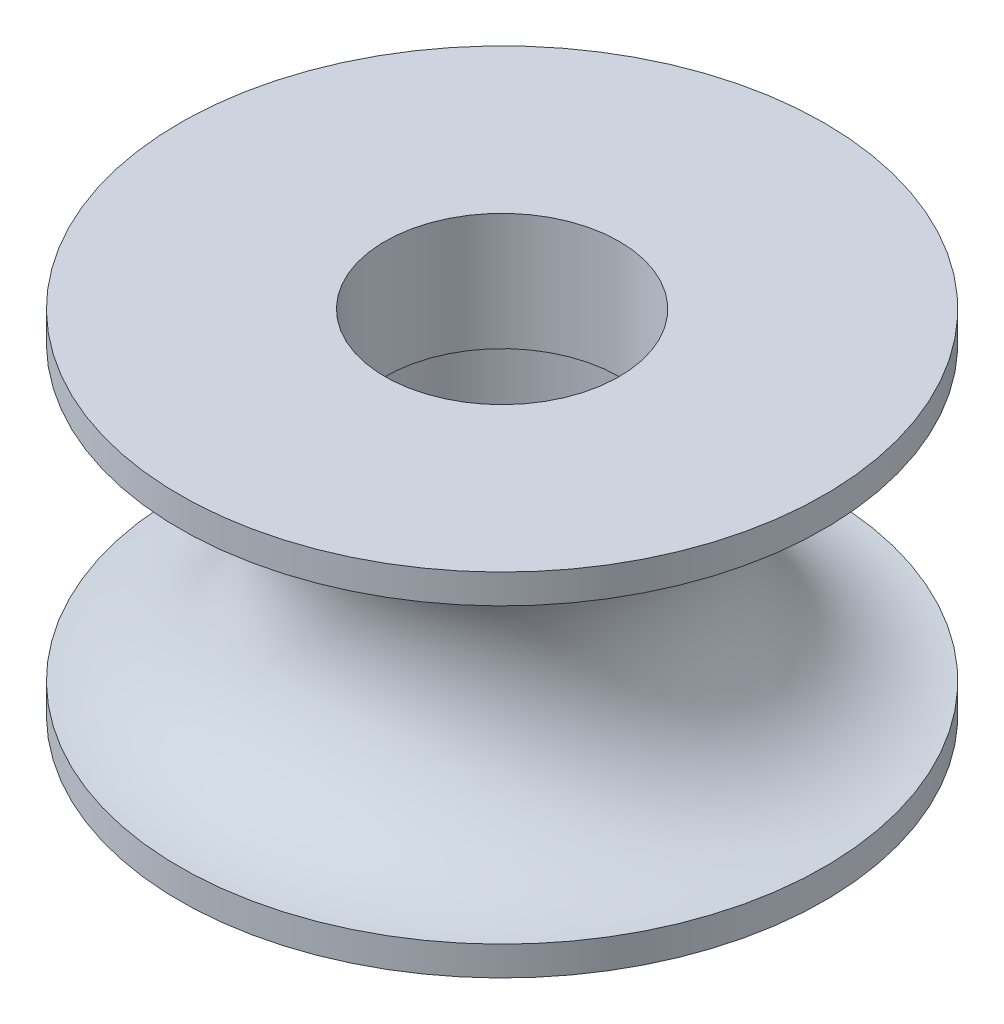
ISO-10303-21;
HEADER;
FILE_DESCRIPTION(('STEP AP214'),'2;1');
FILE_NAME('part.step','',(''),(''),'','','');
FILE_SCHEMA(('AUTOMOTIVE_DESIGN { 1 0 10303 214 1 1 1 1 }'));
ENDSEC;
DATA;
#1=APPLICATION_CONTEXT('core data for automotive mechanical design processes');
#2=APPLICATION_PROTOCOL_DEFINITION('international standard','automotive_design',2000,#1);
#3=PRODUCT_CONTEXT('',#1,'mechanical');
#4=PRODUCT('Part','Part','',(#3));
#5=PRODUCT_RELATED_PRODUCT_CATEGORY('part','',(#4));
#6=PRODUCT_DEFINITION_FORMATION('','',#4);
#7=PRODUCT_DEFINITION_CONTEXT('part definition',#1,'design');
#8=PRODUCT_DEFINITION('design','',#6,#7);
#9=PRODUCT_DEFINITION_SHAPE('','',#8);
#10=(LENGTH_UNIT() NAMED_UNIT(*) SI_UNIT(.MILLI.,.METRE.));
#11=(NAMED_UNIT(*) PLANE_ANGLE_UNIT() SI_UNIT($,.RADIAN.));
#12=(NAMED_UNIT(*) SI_UNIT($,.STERADIAN.) SOLID_ANGLE_UNIT());
#13=UNCERTAINTY_MEASURE_WITH_UNIT(LENGTH_MEASURE(1.E-05),#10,'distance_accuracy_value','');
#14=(GEOMETRIC_REPRESENTATION_CONTEXT(3) GLOBAL_UNCERTAINTY_ASSIGNED_CONTEXT((#13)) GLOBAL_UNIT_ASSIGNED_CONTEXT((#10,
#11,#12)) REPRESENTATION_CONTEXT('',''));
#15=CARTESIAN_POINT('',(0.,0.,0.));
#16=DIRECTION('',(0.,0.,1.));
#17=DIRECTION('',(1.,0.,0.));
#18=AXIS2_PLACEMENT_3D('',#15,#16,#17);
#19=CARTESIAN_POINT('',(-11.,-6.,0.));
#20=DIRECTION('',(0.,1.,0.));
#21=DIRECTION('',(0.,0.,1.));
#22=AXIS2_PLACEMENT_3D('',#19,#20,#21);
#23=PLANE('',#22);
#24=CARTESIAN_POINT('',(0.,-6.,0.));
#25=DIRECTION('',(0.,-1.,0.));
#26=DIRECTION('',(0.,0.,-1.));
#27=AXIS2_PLACEMENT_3D('',#24,#25,#26);
#28=CIRCLE('',#27,5.1);
#29=CARTESIAN_POINT('',(0.,-6.,-5.1));
#30=VERTEX_POINT('',#29);
#31=EDGE_CURVE('E75',#30,#30,#28,.T.);
#32=ORIENTED_EDGE('',*,*,#31,.F.);
#33=EDGE_LOOP('',(#32));
#34=FACE_BOUND('',#33,.T.);
#35=CARTESIAN_POINT('',(0.,-6.,0.));
#36=DIRECTION('',(0.,-1.,0.));
#37=DIRECTION('',(0.,0.,-1.));
#38=AXIS2_PLACEMENT_3D('',#35,#36,#37);
#39=CIRCLE('',#38,11.);
#40=CARTESIAN_POINT('',(0.,-6.,-11.));
#41=VERTEX_POINT('',#40);
#42=EDGE_CURVE('E10',#41,#41,#39,.T.);
#43=ORIENTED_EDGE('',*,*,#42,.T.);
#44=EDGE_LOOP('',(#43));
#45=FACE_BOUND('',#44,.T.);
#46=ADVANCED_FACE('F43',(#34,#45),#23,.F.);
#47=CARTESIAN_POINT('',(0.,0.,0.));
#48=DIRECTION('',(0.,-1.,0.));
#49=DIRECTION('',(0.,0.,-1.));
#50=AXIS2_PLACEMENT_3D('',#47,#48,#49);
#51=CYLINDRICAL_SURFACE('',#50,11.);
#52=ORIENTED_EDGE('',*,*,#42,.F.);
#53=EDGE_LOOP('',(#52));
#54=FACE_BOUND('',#53,.T.);
#55=CARTESIAN_POINT('',(0.,-5.,0.));
#56=DIRECTION('',(0.,-1.,0.));
#57=DIRECTION('',(0.,0.,-1.));
#58=AXIS2_PLACEMENT_3D('',#55,#56,#57);
#59=CIRCLE('',#58,11.);
#60=CARTESIAN_POINT('',(0.,-5.,-11.));
#61=VERTEX_POINT('',#60);
#62=EDGE_CURVE('E50',#61,#61,#59,.T.);
#63=ORIENTED_EDGE('',*,*,#62,.T.);
#64=EDGE_LOOP('',(#63));
#65=FACE_BOUND('',#64,.T.);
#66=ADVANCED_FACE('F93',(#54,#65),#51,.T.);
#67=CARTESIAN_POINT('',(0.,0.,0.));
#68=DIRECTION('',(0.,-1.,0.));
#69=DIRECTION('',(0.,0.,-1.));
#70=AXIS2_PLACEMENT_3D('',#67,#68,#69);
#71=TOROIDAL_SURFACE('',#70,11.,5.);
#72=ORIENTED_EDGE('',*,*,#62,.F.);
#73=EDGE_LOOP('',(#72));
#74=FACE_BOUND('',#73,.T.);
#75=CARTESIAN_POINT('',(0.,5.,0.));
#76=DIRECTION('',(0.,-1.,0.));
#77=DIRECTION('',(0.,0.,-1.));
#78=AXIS2_PLACEMENT_3D('',#75,#76,#77);
#79=CIRCLE('',#78,11.);
#80=CARTESIAN_POINT('',(0.,5.,-11.));
#81=VERTEX_POINT('',#80);
#82=EDGE_CURVE('E55',#81,#81,#79,.T.);
#83=ORIENTED_EDGE('',*,*,#82,.T.);
#84=EDGE_LOOP('',(#83));
#85=FACE_BOUND('',#84,.T.);
#86=ADVANCED_FACE('F99',(#74,#85),#71,.F.);
#87=CARTESIAN_POINT('',(0.,0.,0.));
#88=DIRECTION('',(0.,-1.,0.));
#89=DIRECTION('',(0.,0.,-1.));
#90=AXIS2_PLACEMENT_3D('',#87,#88,#89);
#91=CYLINDRICAL_SURFACE('',#90,11.);
#92=CARTESIAN_POINT('',(0.,6.,0.));
#93=DIRECTION('',(0.,-1.,0.));
#94=DIRECTION('',(0.,0.,-1.));
#95=AXIS2_PLACEMENT_3D('',#92,#93,#94);
#96=CIRCLE('',#95,11.);
#97=CARTESIAN_POINT('',(0.,6.,-11.));
#98=VERTEX_POINT('',#97);
#99=EDGE_CURVE('E60',#98,#98,#96,.T.);
#100=ORIENTED_EDGE('',*,*,#99,.T.);
#101=EDGE_LOOP('',(#100));
#102=FACE_BOUND('',#101,.T.);
#103=ORIENTED_EDGE('',*,*,#82,.F.);
#104=EDGE_LOOP('',(#103));
#105=FACE_BOUND('',#104,.T.);
#106=ADVANCED_FACE('F104',(#102,#105),#91,.T.);
#107=CARTESIAN_POINT('',(-11.,6.,0.));
#108=DIRECTION('',(0.,1.,0.));
#109=DIRECTION('',(0.,0.,1.));
#110=AXIS2_PLACEMENT_3D('',#107,#108,#109);
#111=PLANE('',#110);
#112=ORIENTED_EDGE('',*,*,#99,.F.);
#113=EDGE_LOOP('',(#112));
#114=FACE_BOUND('',#113,.T.);
#115=CARTESIAN_POINT('',(0.,6.,0.));
#116=DIRECTION('',(0.,-1.,0.));
#117=DIRECTION('',(0.,0.,-1.));
#118=AXIS2_PLACEMENT_3D('',#115,#116,#117);
#119=CIRCLE('',#118,4.);
#120=CARTESIAN_POINT('',(0.,6.,-4.));
#121=VERTEX_POINT('',#120);
#122=EDGE_CURVE('E70',#121,#121,#119,.T.);
#123=ORIENTED_EDGE('',*,*,#122,.T.);
#124=EDGE_LOOP('',(#123));
#125=FACE_BOUND('',#124,.T.);
#126=ADVANCED_FACE('F110',(#114,#125),#111,.T.);
#127=CARTESIAN_POINT('',(-5.,2.,0.));
#128=DIRECTION('',(0.,1.,0.));
#129=DIRECTION('',(0.,0.,1.));
#130=AXIS2_PLACEMENT_3D('',#127,#128,#129);
#131=PLANE('',#130);
#132=CARTESIAN_POINT('',(0.,2.,0.));
#133=DIRECTION('',(0.,-1.,0.));
#134=DIRECTION('',(0.,0.,-1.));
#135=AXIS2_PLACEMENT_3D('',#132,#133,#134);
#136=CIRCLE('',#135,4.);
#137=CARTESIAN_POINT('',(0.,2.,-4.));
#138=VERTEX_POINT('',#137);
#139=EDGE_CURVE('E66',#138,#138,#136,.T.);
#140=ORIENTED_EDGE('',*,*,#139,.F.);
#141=EDGE_LOOP('',(#140));
#142=FACE_BOUND('',#141,.T.);
#143=CARTESIAN_POINT('',(0.,2.,0.));
#144=DIRECTION('',(0.,-1.,0.));
#145=DIRECTION('',(0.,0.,-1.));
#146=AXIS2_PLACEMENT_3D('',#143,#144,#145);
#147=CIRCLE('',#146,5.1);
#148=CARTESIAN_POINT('',(0.,2.,-5.1));
#149=VERTEX_POINT('',#148);
#150=EDGE_CURVE('E74',#149,#149,#147,.T.);
#151=ORIENTED_EDGE('',*,*,#150,.T.);
#152=EDGE_LOOP('',(#151));
#153=FACE_BOUND('',#152,.T.);
#154=ADVANCED_FACE('F83',(#142,#153),#131,.F.);
#155=CARTESIAN_POINT('',(0.,0.,0.));
#156=DIRECTION('',(0.,-1.,0.));
#157=DIRECTION('',(0.,0.,-1.));
#158=AXIS2_PLACEMENT_3D('',#155,#156,#157);
#159=CYLINDRICAL_SURFACE('',#158,4.);
#160=ORIENTED_EDGE('',*,*,#122,.F.);
#161=EDGE_LOOP('',(#160));
#162=FACE_BOUND('',#161,.T.);
#163=ORIENTED_EDGE('',*,*,#139,.T.);
#164=EDGE_LOOP('',(#163));
#165=FACE_BOUND('',#164,.T.);
#166=ADVANCED_FACE('F88',(#162,#165),#159,.F.);
#167=CARTESIAN_POINT('',(0.,2.,0.));
#168=DIRECTION('',(0.,-1.,0.));
#169=DIRECTION('',(0.,0.,-1.));
#170=AXIS2_PLACEMENT_3D('',#167,#168,#169);
#171=CYLINDRICAL_SURFACE('',#170,5.1);
#172=ORIENTED_EDGE('',*,*,#150,.F.);
#173=EDGE_LOOP('',(#172));
#174=FACE_BOUND('',#173,.T.);
#175=ORIENTED_EDGE('',*,*,#31,.T.);
#176=EDGE_LOOP('',(#175));
#177=FACE_BOUND('',#176,.T.);
#178=ADVANCED_FACE('F85',(#174,#177),#171,.F.);
#179=CLOSED_SHELL('',(#46,#66,#86,#106,#126,#154,#166,#178));
#180=MANIFOLD_SOLID_BREP('B2',#179);
#181=ADVANCED_BREP_SHAPE_REPRESENTATION('',(#18,#180),#14);
#182=SHAPE_DEFINITION_REPRESENTATION(#9,#181);
ENDSEC;
END-ISO-10303-21;
